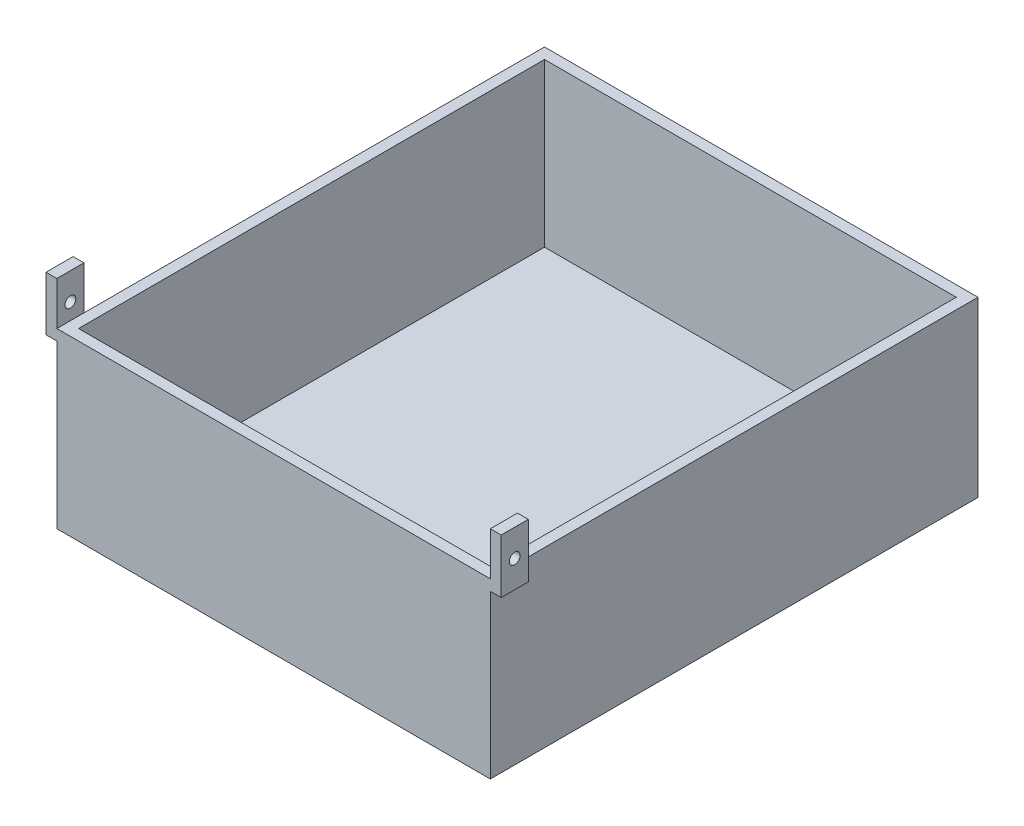
ISO-10303-21;
HEADER;
FILE_DESCRIPTION(('STEP AP214'),'2;1');
FILE_NAME('part.step','',(''),(''),'','','');
FILE_SCHEMA(('AUTOMOTIVE_DESIGN { 1 0 10303 214 1 1 1 1 }'));
ENDSEC;
DATA;
#1=APPLICATION_CONTEXT('core data for automotive mechanical design processes');
#2=APPLICATION_PROTOCOL_DEFINITION('international standard','automotive_design',2000,#1);
#3=PRODUCT_CONTEXT('',#1,'mechanical');
#4=PRODUCT('Part','Part','',(#3));
#5=PRODUCT_RELATED_PRODUCT_CATEGORY('part','',(#4));
#6=PRODUCT_DEFINITION_FORMATION('','',#4);
#7=PRODUCT_DEFINITION_CONTEXT('part definition',#1,'design');
#8=PRODUCT_DEFINITION('design','',#6,#7);
#9=PRODUCT_DEFINITION_SHAPE('','',#8);
#10=(LENGTH_UNIT() NAMED_UNIT(*) SI_UNIT(.MILLI.,.METRE.));
#11=(NAMED_UNIT(*) PLANE_ANGLE_UNIT() SI_UNIT($,.RADIAN.));
#12=(NAMED_UNIT(*) SI_UNIT($,.STERADIAN.) SOLID_ANGLE_UNIT());
#13=UNCERTAINTY_MEASURE_WITH_UNIT(LENGTH_MEASURE(1.E-05),#10,'distance_accuracy_value','');
#14=(GEOMETRIC_REPRESENTATION_CONTEXT(3) GLOBAL_UNCERTAINTY_ASSIGNED_CONTEXT((#13)) GLOBAL_UNIT_ASSIGNED_CONTEXT((#10,
#11,#12)) REPRESENTATION_CONTEXT('',''));
#15=CARTESIAN_POINT('',(0.,0.,0.));
#16=DIRECTION('',(0.,0.,1.));
#17=DIRECTION('',(1.,0.,0.));
#18=AXIS2_PLACEMENT_3D('',#15,#16,#17);
#19=CARTESIAN_POINT('',(-40.,2.,45.));
#20=DIRECTION('',(1.,0.,0.));
#21=DIRECTION('',(0.,0.,-1.));
#22=AXIS2_PLACEMENT_3D('',#19,#20,#21);
#23=PLANE('',#22);
#24=DIRECTION('',(0.,0.,1.));
#25=VECTOR('',#24,1.);
#26=CARTESIAN_POINT('',(-40.,30.,45.));
#27=LINE('',#26,#25);
#28=CARTESIAN_POINT('',(-40.,30.,40.));
#29=VERTEX_POINT('',#28);
#30=CARTESIAN_POINT('',(-40.,30.,45.));
#31=VERTEX_POINT('',#30);
#32=EDGE_CURVE('E173',#29,#31,#27,.T.);
#33=ORIENTED_EDGE('',*,*,#32,.F.);
#34=DIRECTION('',(0.,-1.,0.));
#35=VECTOR('',#34,1.);
#36=CARTESIAN_POINT('',(-40.,30.,40.));
#37=LINE('',#36,#35);
#38=CARTESIAN_POINT('',(-40.,32.,40.));
#39=VERTEX_POINT('',#38);
#40=EDGE_CURVE('E11',#39,#29,#37,.T.);
#41=ORIENTED_EDGE('',*,*,#40,.F.);
#42=DIRECTION('',(0.,0.,1.));
#43=VECTOR('',#42,1.);
#44=CARTESIAN_POINT('',(-40.,32.,-45.));
#45=LINE('',#44,#43);
#46=CARTESIAN_POINT('',(-40.,32.,-45.));
#47=VERTEX_POINT('',#46);
#48=EDGE_CURVE('E469',#47,#39,#45,.T.);
#49=ORIENTED_EDGE('',*,*,#48,.F.);
#50=DIRECTION('',(0.,-1.,0.));
#51=VECTOR('',#50,1.);
#52=CARTESIAN_POINT('',(-40.,2.,-45.));
#53=LINE('',#52,#51);
#54=CARTESIAN_POINT('',(-40.,0.,-45.));
#55=VERTEX_POINT('',#54);
#56=EDGE_CURVE('E460',#47,#55,#53,.T.);
#57=ORIENTED_EDGE('',*,*,#56,.T.);
#58=DIRECTION('',(0.,0.,1.));
#59=VECTOR('',#58,1.);
#60=CARTESIAN_POINT('',(-40.,0.,45.));
#61=LINE('',#60,#59);
#62=CARTESIAN_POINT('',(-40.,0.,45.));
#63=VERTEX_POINT('',#62);
#64=EDGE_CURVE('E468',#55,#63,#61,.T.);
#65=ORIENTED_EDGE('',*,*,#64,.T.);
#66=DIRECTION('',(0.,-1.,0.));
#67=VECTOR('',#66,1.);
#68=CARTESIAN_POINT('',(-40.,2.,45.));
#69=LINE('',#68,#67);
#70=EDGE_CURVE('E43',#31,#63,#69,.T.);
#71=ORIENTED_EDGE('',*,*,#70,.F.);
#72=EDGE_LOOP('',(#33,#41,#49,#57,#65,#71));
#73=FACE_BOUND('',#72,.T.);
#74=ADVANCED_FACE('F35',(#73),#23,.F.);
#75=CARTESIAN_POINT('',(40.,2.,45.));
#76=DIRECTION('',(-1.,0.,0.));
#77=DIRECTION('',(0.,0.,1.));
#78=AXIS2_PLACEMENT_3D('',#75,#76,#77);
#79=PLANE('',#78);
#80=DIRECTION('',(0.,1.,0.));
#81=VECTOR('',#80,1.);
#82=CARTESIAN_POINT('',(40.,30.,40.));
#83=LINE('',#82,#81);
#84=CARTESIAN_POINT('',(40.,30.,40.));
#85=VERTEX_POINT('',#84);
#86=CARTESIAN_POINT('',(40.,32.,40.));
#87=VERTEX_POINT('',#86);
#88=EDGE_CURVE('E565',#85,#87,#83,.T.);
#89=ORIENTED_EDGE('',*,*,#88,.F.);
#90=DIRECTION('',(0.,0.,-1.));
#91=VECTOR('',#90,1.);
#92=CARTESIAN_POINT('',(40.,30.,45.));
#93=LINE('',#92,#91);
#94=CARTESIAN_POINT('',(40.,30.,45.));
#95=VERTEX_POINT('',#94);
#96=EDGE_CURVE('E488',#95,#85,#93,.T.);
#97=ORIENTED_EDGE('',*,*,#96,.F.);
#98=DIRECTION('',(0.,-1.,0.));
#99=VECTOR('',#98,1.);
#100=CARTESIAN_POINT('',(40.,2.,45.));
#101=LINE('',#100,#99);
#102=CARTESIAN_POINT('',(40.,0.,45.));
#103=VERTEX_POINT('',#102);
#104=EDGE_CURVE('E482',#95,#103,#101,.T.);
#105=ORIENTED_EDGE('',*,*,#104,.T.);
#106=DIRECTION('',(0.,0.,-1.));
#107=VECTOR('',#106,1.);
#108=CARTESIAN_POINT('',(40.,0.,45.));
#109=LINE('',#108,#107);
#110=CARTESIAN_POINT('',(40.,0.,-45.));
#111=VERTEX_POINT('',#110);
#112=EDGE_CURVE('E466',#103,#111,#109,.T.);
#113=ORIENTED_EDGE('',*,*,#112,.T.);
#114=DIRECTION('',(0.,-1.,0.));
#115=VECTOR('',#114,1.);
#116=CARTESIAN_POINT('',(40.,2.,-45.));
#117=LINE('',#116,#115);
#118=CARTESIAN_POINT('',(40.,32.,-45.));
#119=VERTEX_POINT('',#118);
#120=EDGE_CURVE('E463',#119,#111,#117,.T.);
#121=ORIENTED_EDGE('',*,*,#120,.F.);
#122=DIRECTION('',(0.,0.,-1.));
#123=VECTOR('',#122,1.);
#124=CARTESIAN_POINT('',(40.,32.,45.));
#125=LINE('',#124,#123);
#126=EDGE_CURVE('E508',#87,#119,#125,.T.);
#127=ORIENTED_EDGE('',*,*,#126,.F.);
#128=EDGE_LOOP('',(#89,#97,#105,#113,#121,#127));
#129=FACE_BOUND('',#128,.T.);
#130=ADVANCED_FACE('F233',(#129),#79,.F.);
#131=CARTESIAN_POINT('',(40.,2.,45.));
#132=DIRECTION('',(0.,0.,-1.));
#133=DIRECTION('',(-1.,0.,0.));
#134=AXIS2_PLACEMENT_3D('',#131,#132,#133);
#135=PLANE('',#134);
#136=DIRECTION('',(1.,0.,0.));
#137=VECTOR('',#136,1.);
#138=CARTESIAN_POINT('',(40.,0.,45.));
#139=LINE('',#138,#137);
#140=EDGE_CURVE('E472',#63,#103,#139,.T.);
#141=ORIENTED_EDGE('',*,*,#140,.T.);
#142=ORIENTED_EDGE('',*,*,#104,.F.);
#143=DIRECTION('',(-1.,0.,0.));
#144=VECTOR('',#143,1.);
#145=CARTESIAN_POINT('',(42.,30.,45.));
#146=LINE('',#145,#144);
#147=CARTESIAN_POINT('',(42.,30.,45.));
#148=VERTEX_POINT('',#147);
#149=EDGE_CURVE('E495',#148,#95,#146,.T.);
#150=ORIENTED_EDGE('',*,*,#149,.F.);
#151=DIRECTION('',(0.,-1.,0.));
#152=VECTOR('',#151,1.);
#153=CARTESIAN_POINT('',(42.,30.,45.));
#154=LINE('',#153,#152);
#155=CARTESIAN_POINT('',(42.,40.,45.));
#156=VERTEX_POINT('',#155);
#157=EDGE_CURVE('E570',#156,#148,#154,.T.);
#158=ORIENTED_EDGE('',*,*,#157,.F.);
#159=DIRECTION('',(-1.,0.,0.));
#160=VECTOR('',#159,1.);
#161=CARTESIAN_POINT('',(42.,40.,45.));
#162=LINE('',#161,#160);
#163=CARTESIAN_POINT('',(40.,40.,45.));
#164=VERTEX_POINT('',#163);
#165=EDGE_CURVE('E571',#156,#164,#162,.T.);
#166=ORIENTED_EDGE('',*,*,#165,.T.);
#167=DIRECTION('',(0.,-1.,0.));
#168=VECTOR('',#167,1.);
#169=CARTESIAN_POINT('',(40.,30.,45.));
#170=LINE('',#169,#168);
#171=CARTESIAN_POINT('',(40.,32.,45.));
#172=VERTEX_POINT('',#171);
#173=EDGE_CURVE('E492',#164,#172,#170,.T.);
#174=ORIENTED_EDGE('',*,*,#173,.T.);
#175=DIRECTION('',(1.,0.,0.));
#176=VECTOR('',#175,1.);
#177=CARTESIAN_POINT('',(-40.,32.,45.));
#178=LINE('',#177,#176);
#179=CARTESIAN_POINT('',(-40.,32.,45.));
#180=VERTEX_POINT('',#179);
#181=EDGE_CURVE('E473',#180,#172,#178,.T.);
#182=ORIENTED_EDGE('',*,*,#181,.F.);
#183=DIRECTION('',(0.,1.,0.));
#184=VECTOR('',#183,1.);
#185=CARTESIAN_POINT('',(-40.,30.,45.));
#186=LINE('',#185,#184);
#187=CARTESIAN_POINT('',(-40.,40.,45.));
#188=VERTEX_POINT('',#187);
#189=EDGE_CURVE('E179',#180,#188,#186,.T.);
#190=ORIENTED_EDGE('',*,*,#189,.T.);
#191=DIRECTION('',(1.,0.,0.));
#192=VECTOR('',#191,1.);
#193=CARTESIAN_POINT('',(-42.,40.,45.));
#194=LINE('',#193,#192);
#195=CARTESIAN_POINT('',(-42.,40.,45.));
#196=VERTEX_POINT('',#195);
#197=EDGE_CURVE('E157',#196,#188,#194,.T.);
#198=ORIENTED_EDGE('',*,*,#197,.F.);
#199=DIRECTION('',(0.,1.,0.));
#200=VECTOR('',#199,1.);
#201=CARTESIAN_POINT('',(-42.,30.,45.));
#202=LINE('',#201,#200);
#203=CARTESIAN_POINT('',(-42.,30.,45.));
#204=VERTEX_POINT('',#203);
#205=EDGE_CURVE('E163',#204,#196,#202,.T.);
#206=ORIENTED_EDGE('',*,*,#205,.F.);
#207=DIRECTION('',(1.,0.,0.));
#208=VECTOR('',#207,1.);
#209=CARTESIAN_POINT('',(-42.,30.,45.));
#210=LINE('',#209,#208);
#211=EDGE_CURVE('E206',#204,#31,#210,.T.);
#212=ORIENTED_EDGE('',*,*,#211,.T.);
#213=ORIENTED_EDGE('',*,*,#70,.T.);
#214=EDGE_LOOP('',(#141,#142,#150,#158,#166,#174,#182,#190,#198,#206,#212,#213));
#215=FACE_BOUND('',#214,.T.);
#216=ADVANCED_FACE('F176',(#215),#135,.F.);
#217=CARTESIAN_POINT('',(40.,2.,-45.));
#218=DIRECTION('',(0.,0.,1.));
#219=DIRECTION('',(1.,0.,0.));
#220=AXIS2_PLACEMENT_3D('',#217,#218,#219);
#221=PLANE('',#220);
#222=DIRECTION('',(-1.,0.,0.));
#223=VECTOR('',#222,1.);
#224=CARTESIAN_POINT('',(40.,0.,-45.));
#225=LINE('',#224,#223);
#226=EDGE_CURVE('E457',#111,#55,#225,.T.);
#227=ORIENTED_EDGE('',*,*,#226,.T.);
#228=ORIENTED_EDGE('',*,*,#56,.F.);
#229=DIRECTION('',(-1.,0.,0.));
#230=VECTOR('',#229,1.);
#231=CARTESIAN_POINT('',(40.,32.,-45.));
#232=LINE('',#231,#230);
#233=EDGE_CURVE('E507',#119,#47,#232,.T.);
#234=ORIENTED_EDGE('',*,*,#233,.F.);
#235=ORIENTED_EDGE('',*,*,#120,.T.);
#236=EDGE_LOOP('',(#227,#228,#234,#235));
#237=FACE_BOUND('',#236,.T.);
#238=ADVANCED_FACE('F300',(#237),#221,.F.);
#239=CARTESIAN_POINT('',(0.,0.,0.));
#240=DIRECTION('',(0.,1.,0.));
#241=DIRECTION('',(0.,0.,1.));
#242=AXIS2_PLACEMENT_3D('',#239,#240,#241);
#243=PLANE('',#242);
#244=ORIENTED_EDGE('',*,*,#64,.F.);
#245=ORIENTED_EDGE('',*,*,#226,.F.);
#246=ORIENTED_EDGE('',*,*,#112,.F.);
#247=ORIENTED_EDGE('',*,*,#140,.F.);
#248=EDGE_LOOP('',(#244,#245,#246,#247));
#249=FACE_BOUND('',#248,.T.);
#250=ADVANCED_FACE('F293',(#249),#243,.F.);
#251=CARTESIAN_POINT('',(0.,32.,0.));
#252=DIRECTION('',(0.,1.,0.));
#253=DIRECTION('',(0.,0.,1.));
#254=AXIS2_PLACEMENT_3D('',#251,#252,#253);
#255=PLANE('',#254);
#256=EDGE_CURVE('E504',#172,#87,#125,.T.);
#257=ORIENTED_EDGE('',*,*,#256,.T.);
#258=ORIENTED_EDGE('',*,*,#126,.T.);
#259=ORIENTED_EDGE('',*,*,#233,.T.);
#260=ORIENTED_EDGE('',*,*,#48,.T.);
#261=EDGE_CURVE('E203',#39,#180,#45,.T.);
#262=ORIENTED_EDGE('',*,*,#261,.T.);
#263=ORIENTED_EDGE('',*,*,#181,.T.);
#264=EDGE_LOOP('',(#257,#258,#259,#260,#262,#263));
#265=FACE_BOUND('',#264,.T.);
#266=DIRECTION('',(0.,0.,-1.));
#267=VECTOR('',#266,1.);
#268=CARTESIAN_POINT('',(38.,32.,43.));
#269=LINE('',#268,#267);
#270=CARTESIAN_POINT('',(38.,32.,43.));
#271=VERTEX_POINT('',#270);
#272=CARTESIAN_POINT('',(38.,32.,-43.));
#273=VERTEX_POINT('',#272);
#274=EDGE_CURVE('E522',#271,#273,#269,.T.);
#275=ORIENTED_EDGE('',*,*,#274,.F.);
#276=DIRECTION('',(1.,0.,0.));
#277=VECTOR('',#276,1.);
#278=CARTESIAN_POINT('',(-38.,32.,43.));
#279=LINE('',#278,#277);
#280=CARTESIAN_POINT('',(-38.,32.,43.));
#281=VERTEX_POINT('',#280);
#282=EDGE_CURVE('E524',#281,#271,#279,.T.);
#283=ORIENTED_EDGE('',*,*,#282,.F.);
#284=DIRECTION('',(0.,0.,1.));
#285=VECTOR('',#284,1.);
#286=CARTESIAN_POINT('',(-38.,32.,-43.));
#287=LINE('',#286,#285);
#288=CARTESIAN_POINT('',(-38.,32.,-43.));
#289=VERTEX_POINT('',#288);
#290=EDGE_CURVE('E531',#289,#281,#287,.T.);
#291=ORIENTED_EDGE('',*,*,#290,.F.);
#292=DIRECTION('',(-1.,0.,0.));
#293=VECTOR('',#292,1.);
#294=CARTESIAN_POINT('',(38.,32.,-43.));
#295=LINE('',#294,#293);
#296=EDGE_CURVE('E526',#273,#289,#295,.T.);
#297=ORIENTED_EDGE('',*,*,#296,.F.);
#298=EDGE_LOOP('',(#275,#283,#291,#297));
#299=FACE_BOUND('',#298,.T.);
#300=ADVANCED_FACE('F289',(#265,#299),#255,.T.);
#301=CARTESIAN_POINT('',(-38.,32.,43.));
#302=DIRECTION('',(0.,0.,-1.));
#303=DIRECTION('',(-1.,0.,0.));
#304=AXIS2_PLACEMENT_3D('',#301,#302,#303);
#305=PLANE('',#304);
#306=DIRECTION('',(1.,0.,0.));
#307=VECTOR('',#306,1.);
#308=CARTESIAN_POINT('',(-38.,2.,43.));
#309=LINE('',#308,#307);
#310=CARTESIAN_POINT('',(-38.,2.,43.));
#311=VERTEX_POINT('',#310);
#312=CARTESIAN_POINT('',(38.,2.,43.));
#313=VERTEX_POINT('',#312);
#314=EDGE_CURVE('E498',#311,#313,#309,.T.);
#315=ORIENTED_EDGE('',*,*,#314,.F.);
#316=DIRECTION('',(0.,-1.,0.));
#317=VECTOR('',#316,1.);
#318=CARTESIAN_POINT('',(-38.,32.,43.));
#319=LINE('',#318,#317);
#320=EDGE_CURVE('E538',#281,#311,#319,.T.);
#321=ORIENTED_EDGE('',*,*,#320,.F.);
#322=ORIENTED_EDGE('',*,*,#282,.T.);
#323=DIRECTION('',(0.,-1.,0.));
#324=VECTOR('',#323,1.);
#325=CARTESIAN_POINT('',(38.,32.,43.));
#326=LINE('',#325,#324);
#327=EDGE_CURVE('E511',#271,#313,#326,.T.);
#328=ORIENTED_EDGE('',*,*,#327,.T.);
#329=EDGE_LOOP('',(#315,#321,#322,#328));
#330=FACE_BOUND('',#329,.T.);
#331=ADVANCED_FACE('F285',(#330),#305,.T.);
#332=CARTESIAN_POINT('',(38.,32.,43.));
#333=DIRECTION('',(-1.,0.,0.));
#334=DIRECTION('',(0.,0.,1.));
#335=AXIS2_PLACEMENT_3D('',#332,#333,#334);
#336=PLANE('',#335);
#337=DIRECTION('',(0.,0.,-1.));
#338=VECTOR('',#337,1.);
#339=CARTESIAN_POINT('',(38.,2.,43.));
#340=LINE('',#339,#338);
#341=CARTESIAN_POINT('',(38.,2.,-43.));
#342=VERTEX_POINT('',#341);
#343=EDGE_CURVE('E540',#313,#342,#340,.T.);
#344=ORIENTED_EDGE('',*,*,#343,.F.);
#345=ORIENTED_EDGE('',*,*,#327,.F.);
#346=ORIENTED_EDGE('',*,*,#274,.T.);
#347=DIRECTION('',(0.,-1.,0.));
#348=VECTOR('',#347,1.);
#349=CARTESIAN_POINT('',(38.,32.,-43.));
#350=LINE('',#349,#348);
#351=EDGE_CURVE('E549',#273,#342,#350,.T.);
#352=ORIENTED_EDGE('',*,*,#351,.T.);
#353=EDGE_LOOP('',(#344,#345,#346,#352));
#354=FACE_BOUND('',#353,.T.);
#355=ADVANCED_FACE('F281',(#354),#336,.T.);
#356=CARTESIAN_POINT('',(38.,32.,-43.));
#357=DIRECTION('',(0.,0.,1.));
#358=DIRECTION('',(1.,0.,0.));
#359=AXIS2_PLACEMENT_3D('',#356,#357,#358);
#360=PLANE('',#359);
#361=DIRECTION('',(-1.,0.,0.));
#362=VECTOR('',#361,1.);
#363=CARTESIAN_POINT('',(38.,2.,-43.));
#364=LINE('',#363,#362);
#365=CARTESIAN_POINT('',(-38.,2.,-43.));
#366=VERTEX_POINT('',#365);
#367=EDGE_CURVE('E542',#342,#366,#364,.T.);
#368=ORIENTED_EDGE('',*,*,#367,.F.);
#369=ORIENTED_EDGE('',*,*,#351,.F.);
#370=ORIENTED_EDGE('',*,*,#296,.T.);
#371=DIRECTION('',(0.,-1.,0.));
#372=VECTOR('',#371,1.);
#373=CARTESIAN_POINT('',(-38.,32.,-43.));
#374=LINE('',#373,#372);
#375=EDGE_CURVE('E547',#289,#366,#374,.T.);
#376=ORIENTED_EDGE('',*,*,#375,.T.);
#377=EDGE_LOOP('',(#368,#369,#370,#376));
#378=FACE_BOUND('',#377,.T.);
#379=ADVANCED_FACE('F277',(#378),#360,.T.);
#380=CARTESIAN_POINT('',(-38.,32.,-43.));
#381=DIRECTION('',(1.,0.,0.));
#382=DIRECTION('',(0.,0.,-1.));
#383=AXIS2_PLACEMENT_3D('',#380,#381,#382);
#384=PLANE('',#383);
#385=DIRECTION('',(0.,0.,1.));
#386=VECTOR('',#385,1.);
#387=CARTESIAN_POINT('',(-38.,2.,-43.));
#388=LINE('',#387,#386);
#389=EDGE_CURVE('E533',#366,#311,#388,.T.);
#390=ORIENTED_EDGE('',*,*,#389,.F.);
#391=ORIENTED_EDGE('',*,*,#375,.F.);
#392=ORIENTED_EDGE('',*,*,#290,.T.);
#393=ORIENTED_EDGE('',*,*,#320,.T.);
#394=EDGE_LOOP('',(#390,#391,#392,#393));
#395=FACE_BOUND('',#394,.T.);
#396=ADVANCED_FACE('F274',(#395),#384,.T.);
#397=CARTESIAN_POINT('',(0.,2.,0.));
#398=DIRECTION('',(0.,1.,0.));
#399=DIRECTION('',(0.,0.,1.));
#400=AXIS2_PLACEMENT_3D('',#397,#398,#399);
#401=PLANE('',#400);
#402=ORIENTED_EDGE('',*,*,#314,.T.);
#403=ORIENTED_EDGE('',*,*,#343,.T.);
#404=ORIENTED_EDGE('',*,*,#367,.T.);
#405=ORIENTED_EDGE('',*,*,#389,.T.);
#406=EDGE_LOOP('',(#402,#403,#404,#405));
#407=FACE_BOUND('',#406,.T.);
#408=ADVANCED_FACE('F262',(#407),#401,.T.);
#409=CARTESIAN_POINT('',(40.,0.,0.));
#410=DIRECTION('',(-1.,0.,0.));
#411=DIRECTION('',(0.,0.,1.));
#412=AXIS2_PLACEMENT_3D('',#409,#410,#411);
#413=PLANE('',#412);
#414=CARTESIAN_POINT('',(40.,35.,42.5));
#415=DIRECTION('',(1.,0.,0.));
#416=DIRECTION('',(0.,0.,-1.));
#417=AXIS2_PLACEMENT_3D('',#414,#415,#416);
#418=CIRCLE('',#417,0.999999999999998);
#419=CARTESIAN_POINT('',(40.,35.,41.5));
#420=VERTEX_POINT('',#419);
#421=EDGE_CURVE('E181',#420,#420,#418,.T.);
#422=ORIENTED_EDGE('',*,*,#421,.T.);
#423=EDGE_LOOP('',(#422));
#424=FACE_BOUND('',#423,.T.);
#425=ORIENTED_EDGE('',*,*,#256,.F.);
#426=ORIENTED_EDGE('',*,*,#173,.F.);
#427=DIRECTION('',(0.,0.,1.));
#428=VECTOR('',#427,1.);
#429=CARTESIAN_POINT('',(40.,40.,45.));
#430=LINE('',#429,#428);
#431=CARTESIAN_POINT('',(40.,40.,40.));
#432=VERTEX_POINT('',#431);
#433=EDGE_CURVE('E568',#432,#164,#430,.T.);
#434=ORIENTED_EDGE('',*,*,#433,.F.);
#435=EDGE_CURVE('E491',#87,#432,#83,.T.);
#436=ORIENTED_EDGE('',*,*,#435,.F.);
#437=EDGE_LOOP('',(#425,#426,#434,#436));
#438=FACE_BOUND('',#437,.T.);
#439=ADVANCED_FACE('F258',(#424,#438),#413,.T.);
#440=CARTESIAN_POINT('',(42.,0.,0.));
#441=DIRECTION('',(-1.,0.,0.));
#442=DIRECTION('',(0.,0.,1.));
#443=AXIS2_PLACEMENT_3D('',#440,#441,#442);
#444=PLANE('',#443);
#445=ORIENTED_EDGE('',*,*,#157,.T.);
#446=DIRECTION('',(0.,0.,-1.));
#447=VECTOR('',#446,1.);
#448=CARTESIAN_POINT('',(42.,30.,45.));
#449=LINE('',#448,#447);
#450=CARTESIAN_POINT('',(42.,30.,40.));
#451=VERTEX_POINT('',#450);
#452=EDGE_CURVE('E582',#148,#451,#449,.T.);
#453=ORIENTED_EDGE('',*,*,#452,.T.);
#454=DIRECTION('',(0.,1.,0.));
#455=VECTOR('',#454,1.);
#456=CARTESIAN_POINT('',(42.,30.,40.));
#457=LINE('',#456,#455);
#458=CARTESIAN_POINT('',(42.,40.,40.));
#459=VERTEX_POINT('',#458);
#460=EDGE_CURVE('E581',#451,#459,#457,.T.);
#461=ORIENTED_EDGE('',*,*,#460,.T.);
#462=DIRECTION('',(0.,0.,1.));
#463=VECTOR('',#462,1.);
#464=CARTESIAN_POINT('',(42.,40.,45.));
#465=LINE('',#464,#463);
#466=EDGE_CURVE('E563',#459,#156,#465,.T.);
#467=ORIENTED_EDGE('',*,*,#466,.T.);
#468=EDGE_LOOP('',(#445,#453,#461,#467));
#469=FACE_BOUND('',#468,.T.);
#470=CARTESIAN_POINT('',(42.,35.,42.5));
#471=DIRECTION('',(1.,0.,0.));
#472=DIRECTION('',(0.,0.,-1.));
#473=AXIS2_PLACEMENT_3D('',#470,#471,#472);
#474=CIRCLE('',#473,0.999999999999998);
#475=CARTESIAN_POINT('',(42.,35.,41.5));
#476=VERTEX_POINT('',#475);
#477=EDGE_CURVE('E184',#476,#476,#474,.T.);
#478=ORIENTED_EDGE('',*,*,#477,.F.);
#479=EDGE_LOOP('',(#478));
#480=FACE_BOUND('',#479,.T.);
#481=ADVANCED_FACE('F254',(#469,#480),#444,.F.);
#482=CARTESIAN_POINT('',(42.,30.,45.));
#483=DIRECTION('',(0.,1.,0.));
#484=DIRECTION('',(0.,0.,1.));
#485=AXIS2_PLACEMENT_3D('',#482,#483,#484);
#486=PLANE('',#485);
#487=ORIENTED_EDGE('',*,*,#96,.T.);
#488=DIRECTION('',(-1.,0.,0.));
#489=VECTOR('',#488,1.);
#490=CARTESIAN_POINT('',(42.,30.,40.));
#491=LINE('',#490,#489);
#492=EDGE_CURVE('E499',#451,#85,#491,.T.);
#493=ORIENTED_EDGE('',*,*,#492,.F.);
#494=ORIENTED_EDGE('',*,*,#452,.F.);
#495=ORIENTED_EDGE('',*,*,#149,.T.);
#496=EDGE_LOOP('',(#487,#493,#494,#495));
#497=FACE_BOUND('',#496,.T.);
#498=ADVANCED_FACE('F257',(#497),#486,.F.);
#499=CARTESIAN_POINT('',(42.,30.,40.));
#500=DIRECTION('',(0.,0.,1.));
#501=DIRECTION('',(1.,0.,0.));
#502=AXIS2_PLACEMENT_3D('',#499,#500,#501);
#503=PLANE('',#502);
#504=ORIENTED_EDGE('',*,*,#88,.T.);
#505=ORIENTED_EDGE('',*,*,#435,.T.);
#506=DIRECTION('',(-1.,0.,0.));
#507=VECTOR('',#506,1.);
#508=CARTESIAN_POINT('',(42.,40.,40.));
#509=LINE('',#508,#507);
#510=EDGE_CURVE('E573',#459,#432,#509,.T.);
#511=ORIENTED_EDGE('',*,*,#510,.F.);
#512=ORIENTED_EDGE('',*,*,#460,.F.);
#513=ORIENTED_EDGE('',*,*,#492,.T.);
#514=EDGE_LOOP('',(#504,#505,#511,#512,#513));
#515=FACE_BOUND('',#514,.T.);
#516=ADVANCED_FACE('F266',(#515),#503,.F.);
#517=CARTESIAN_POINT('',(42.,40.,45.));
#518=DIRECTION('',(0.,-1.,0.));
#519=DIRECTION('',(0.,0.,-1.));
#520=AXIS2_PLACEMENT_3D('',#517,#518,#519);
#521=PLANE('',#520);
#522=ORIENTED_EDGE('',*,*,#433,.T.);
#523=ORIENTED_EDGE('',*,*,#165,.F.);
#524=ORIENTED_EDGE('',*,*,#466,.F.);
#525=ORIENTED_EDGE('',*,*,#510,.T.);
#526=EDGE_LOOP('',(#522,#523,#524,#525));
#527=FACE_BOUND('',#526,.T.);
#528=ADVANCED_FACE('F228',(#527),#521,.F.);
#529=CARTESIAN_POINT('',(42.,35.,42.5));
#530=DIRECTION('',(-1.,0.,0.));
#531=DIRECTION('',(0.,0.,1.));
#532=AXIS2_PLACEMENT_3D('',#529,#530,#531);
#533=CYLINDRICAL_SURFACE('',#532,0.999999999999998);
#534=ORIENTED_EDGE('',*,*,#477,.T.);
#535=EDGE_LOOP('',(#534));
#536=FACE_BOUND('',#535,.T.);
#537=ORIENTED_EDGE('',*,*,#421,.F.);
#538=EDGE_LOOP('',(#537));
#539=FACE_BOUND('',#538,.T.);
#540=ADVANCED_FACE('F220',(#536,#539),#533,.F.);
#541=CARTESIAN_POINT('',(-42.,0.,0.));
#542=DIRECTION('',(-1.,0.,0.));
#543=DIRECTION('',(0.,0.,1.));
#544=AXIS2_PLACEMENT_3D('',#541,#542,#543);
#545=PLANE('',#544);
#546=ORIENTED_EDGE('',*,*,#205,.T.);
#547=DIRECTION('',(0.,0.,-1.));
#548=VECTOR('',#547,1.);
#549=CARTESIAN_POINT('',(-42.,40.,45.));
#550=LINE('',#549,#548);
#551=CARTESIAN_POINT('',(-42.,40.,40.));
#552=VERTEX_POINT('',#551);
#553=EDGE_CURVE('E153',#196,#552,#550,.T.);
#554=ORIENTED_EDGE('',*,*,#553,.T.);
#555=DIRECTION('',(0.,-1.,0.));
#556=VECTOR('',#555,1.);
#557=CARTESIAN_POINT('',(-42.,30.,40.));
#558=LINE('',#557,#556);
#559=CARTESIAN_POINT('',(-42.,30.,40.));
#560=VERTEX_POINT('',#559);
#561=EDGE_CURVE('E162',#552,#560,#558,.T.);
#562=ORIENTED_EDGE('',*,*,#561,.T.);
#563=DIRECTION('',(0.,0.,1.));
#564=VECTOR('',#563,1.);
#565=CARTESIAN_POINT('',(-42.,30.,45.));
#566=LINE('',#565,#564);
#567=EDGE_CURVE('E169',#560,#204,#566,.T.);
#568=ORIENTED_EDGE('',*,*,#567,.T.);
#569=EDGE_LOOP('',(#546,#554,#562,#568));
#570=FACE_BOUND('',#569,.T.);
#571=CARTESIAN_POINT('',(-42.,35.,42.5));
#572=DIRECTION('',(-1.,0.,0.));
#573=DIRECTION('',(0.,0.,1.));
#574=AXIS2_PLACEMENT_3D('',#571,#572,#573);
#575=CIRCLE('',#574,0.999999999999998);
#576=CARTESIAN_POINT('',(-42.,35.,43.5));
#577=VERTEX_POINT('',#576);
#578=EDGE_CURVE('E193',#577,#577,#575,.T.);
#579=ORIENTED_EDGE('',*,*,#578,.F.);
#580=EDGE_LOOP('',(#579));
#581=FACE_BOUND('',#580,.T.);
#582=ADVANCED_FACE('F166',(#570,#581),#545,.T.);
#583=CARTESIAN_POINT('',(-40.,0.,0.));
#584=DIRECTION('',(-1.,0.,0.));
#585=DIRECTION('',(0.,0.,1.));
#586=AXIS2_PLACEMENT_3D('',#583,#584,#585);
#587=PLANE('',#586);
#588=ORIENTED_EDGE('',*,*,#261,.F.);
#589=CARTESIAN_POINT('',(-40.,40.,40.));
#590=VERTEX_POINT('',#589);
#591=EDGE_CURVE('E45',#590,#39,#37,.T.);
#592=ORIENTED_EDGE('',*,*,#591,.F.);
#593=DIRECTION('',(0.,0.,-1.));
#594=VECTOR('',#593,1.);
#595=CARTESIAN_POINT('',(-40.,40.,45.));
#596=LINE('',#595,#594);
#597=EDGE_CURVE('E192',#188,#590,#596,.T.);
#598=ORIENTED_EDGE('',*,*,#597,.F.);
#599=ORIENTED_EDGE('',*,*,#189,.F.);
#600=EDGE_LOOP('',(#588,#592,#598,#599));
#601=FACE_BOUND('',#600,.T.);
#602=CARTESIAN_POINT('',(-40.,35.,42.5));
#603=DIRECTION('',(-1.,0.,0.));
#604=DIRECTION('',(0.,0.,1.));
#605=AXIS2_PLACEMENT_3D('',#602,#603,#604);
#606=CIRCLE('',#605,0.999999999999998);
#607=CARTESIAN_POINT('',(-40.,35.,43.5));
#608=VERTEX_POINT('',#607);
#609=EDGE_CURVE('E210',#608,#608,#606,.T.);
#610=ORIENTED_EDGE('',*,*,#609,.T.);
#611=EDGE_LOOP('',(#610));
#612=FACE_BOUND('',#611,.T.);
#613=ADVANCED_FACE('F219',(#601,#612),#587,.F.);
#614=CARTESIAN_POINT('',(-42.,40.,45.));
#615=DIRECTION('',(0.,-1.,0.));
#616=DIRECTION('',(0.,0.,-1.));
#617=AXIS2_PLACEMENT_3D('',#614,#615,#616);
#618=PLANE('',#617);
#619=ORIENTED_EDGE('',*,*,#597,.T.);
#620=DIRECTION('',(1.,0.,0.));
#621=VECTOR('',#620,1.);
#622=CARTESIAN_POINT('',(-42.,40.,40.));
#623=LINE('',#622,#621);
#624=EDGE_CURVE('E159',#552,#590,#623,.T.);
#625=ORIENTED_EDGE('',*,*,#624,.F.);
#626=ORIENTED_EDGE('',*,*,#553,.F.);
#627=ORIENTED_EDGE('',*,*,#197,.T.);
#628=EDGE_LOOP('',(#619,#625,#626,#627));
#629=FACE_BOUND('',#628,.T.);
#630=ADVANCED_FACE('F155',(#629),#618,.F.);
#631=CARTESIAN_POINT('',(-42.,30.,40.));
#632=DIRECTION('',(0.,0.,1.));
#633=DIRECTION('',(0.,-1.,0.));
#634=AXIS2_PLACEMENT_3D('',#631,#632,#633);
#635=PLANE('',#634);
#636=ORIENTED_EDGE('',*,*,#591,.T.);
#637=ORIENTED_EDGE('',*,*,#40,.T.);
#638=DIRECTION('',(1.,0.,0.));
#639=VECTOR('',#638,1.);
#640=CARTESIAN_POINT('',(-42.,30.,40.));
#641=LINE('',#640,#639);
#642=EDGE_CURVE('E186',#560,#29,#641,.T.);
#643=ORIENTED_EDGE('',*,*,#642,.F.);
#644=ORIENTED_EDGE('',*,*,#561,.F.);
#645=ORIENTED_EDGE('',*,*,#624,.T.);
#646=EDGE_LOOP('',(#636,#637,#643,#644,#645));
#647=FACE_BOUND('',#646,.T.);
#648=ADVANCED_FACE('F241',(#647),#635,.F.);
#649=CARTESIAN_POINT('',(-42.,30.,45.));
#650=DIRECTION('',(0.,1.,0.));
#651=DIRECTION('',(0.,0.,1.));
#652=AXIS2_PLACEMENT_3D('',#649,#650,#651);
#653=PLANE('',#652);
#654=ORIENTED_EDGE('',*,*,#32,.T.);
#655=ORIENTED_EDGE('',*,*,#211,.F.);
#656=ORIENTED_EDGE('',*,*,#567,.F.);
#657=ORIENTED_EDGE('',*,*,#642,.T.);
#658=EDGE_LOOP('',(#654,#655,#656,#657));
#659=FACE_BOUND('',#658,.T.);
#660=ADVANCED_FACE('F243',(#659),#653,.F.);
#661=CARTESIAN_POINT('',(-42.,35.,42.5));
#662=DIRECTION('',(1.,0.,0.));
#663=DIRECTION('',(0.,0.,-1.));
#664=AXIS2_PLACEMENT_3D('',#661,#662,#663);
#665=CYLINDRICAL_SURFACE('',#664,0.999999999999998);
#666=ORIENTED_EDGE('',*,*,#578,.T.);
#667=EDGE_LOOP('',(#666));
#668=FACE_BOUND('',#667,.T.);
#669=ORIENTED_EDGE('',*,*,#609,.F.);
#670=EDGE_LOOP('',(#669));
#671=FACE_BOUND('',#670,.T.);
#672=ADVANCED_FACE('F216',(#668,#671),#665,.F.);
#673=CLOSED_SHELL('',(#74,#130,#216,#238,#250,#300,#331,#355,#379,#396,#408,#439,#481,#498,#516,
#528,#540,#582,#613,#630,#648,#660,#672));
#674=MANIFOLD_SOLID_BREP('B2',#673);
#675=ADVANCED_BREP_SHAPE_REPRESENTATION('',(#18,#674),#14);
#676=SHAPE_DEFINITION_REPRESENTATION(#9,#675);
ENDSEC;
END-ISO-10303-21;
